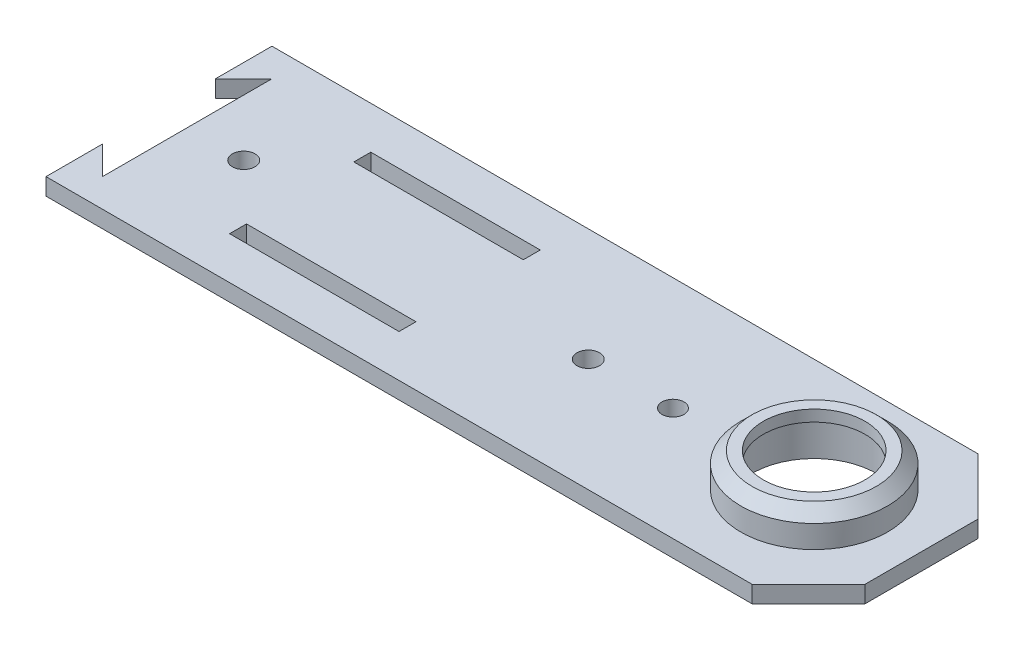
ISO-10303-21;
HEADER;
FILE_DESCRIPTION(('STEP AP214'),'2;1');
FILE_NAME('part.step','',(''),(''),'','','');
FILE_SCHEMA(('AUTOMOTIVE_DESIGN { 1 0 10303 214 1 1 1 1 }'));
ENDSEC;
DATA;
#1=APPLICATION_CONTEXT('core data for automotive mechanical design processes');
#2=APPLICATION_PROTOCOL_DEFINITION('international standard','automotive_design',2000,#1);
#3=PRODUCT_CONTEXT('',#1,'mechanical');
#4=PRODUCT('Part','Part','',(#3));
#5=PRODUCT_RELATED_PRODUCT_CATEGORY('part','',(#4));
#6=PRODUCT_DEFINITION_FORMATION('','',#4);
#7=PRODUCT_DEFINITION_CONTEXT('part definition',#1,'design');
#8=PRODUCT_DEFINITION('design','',#6,#7);
#9=PRODUCT_DEFINITION_SHAPE('','',#8);
#10=(LENGTH_UNIT() NAMED_UNIT(*) SI_UNIT(.MILLI.,.METRE.));
#11=(NAMED_UNIT(*) PLANE_ANGLE_UNIT() SI_UNIT($,.RADIAN.));
#12=(NAMED_UNIT(*) SI_UNIT($,.STERADIAN.) SOLID_ANGLE_UNIT());
#13=UNCERTAINTY_MEASURE_WITH_UNIT(LENGTH_MEASURE(1.E-05),#10,'distance_accuracy_value','');
#14=(GEOMETRIC_REPRESENTATION_CONTEXT(3) GLOBAL_UNCERTAINTY_ASSIGNED_CONTEXT((#13)) GLOBAL_UNIT_ASSIGNED_CONTEXT((#10,
#11,#12)) REPRESENTATION_CONTEXT('',''));
#15=CARTESIAN_POINT('',(0.,0.,0.));
#16=DIRECTION('',(0.,0.,1.));
#17=DIRECTION('',(1.,0.,0.));
#18=AXIS2_PLACEMENT_3D('',#15,#16,#17);
#19=CARTESIAN_POINT('',(0.,3.,0.));
#20=DIRECTION('',(0.,-1.,0.));
#21=DIRECTION('',(0.,0.,-1.));
#22=AXIS2_PLACEMENT_3D('',#19,#20,#21);
#23=PLANE('',#22);
#24=DIRECTION('',(0.,0.,-1.));
#25=VECTOR('',#24,1.);
#26=CARTESIAN_POINT('',(-12.5,3.,12.5));
#27=LINE('',#26,#25);
#28=CARTESIAN_POINT('',(-12.5,3.,12.5));
#29=VERTEX_POINT('',#28);
#30=CARTESIAN_POINT('',(-12.5,3.,9.5));
#31=VERTEX_POINT('',#30);
#32=EDGE_CURVE('E176',#29,#31,#27,.T.);
#33=ORIENTED_EDGE('',*,*,#32,.F.);
#34=DIRECTION('',(1.,0.,0.));
#35=VECTOR('',#34,1.);
#36=CARTESIAN_POINT('',(-42.5,3.,12.5));
#37=LINE('',#36,#35);
#38=CARTESIAN_POINT('',(-42.5,3.,12.5));
#39=VERTEX_POINT('',#38);
#40=EDGE_CURVE('E206',#39,#29,#37,.T.);
#41=ORIENTED_EDGE('',*,*,#40,.F.);
#42=DIRECTION('',(0.,0.,1.));
#43=VECTOR('',#42,1.);
#44=CARTESIAN_POINT('',(-42.5,3.,12.5));
#45=LINE('',#44,#43);
#46=CARTESIAN_POINT('',(-42.5,3.,9.5));
#47=VERTEX_POINT('',#46);
#48=EDGE_CURVE('E202',#47,#39,#45,.T.);
#49=ORIENTED_EDGE('',*,*,#48,.F.);
#50=DIRECTION('',(-1.,0.,0.));
#51=VECTOR('',#50,1.);
#52=CARTESIAN_POINT('',(-42.5,3.,9.5));
#53=LINE('',#52,#51);
#54=EDGE_CURVE('E187',#31,#47,#53,.T.);
#55=ORIENTED_EDGE('',*,*,#54,.F.);
#56=EDGE_LOOP('',(#33,#41,#49,#55));
#57=FACE_BOUND('',#56,.T.);
#58=CARTESIAN_POINT('',(8.50000000000001,3.,0.));
#59=DIRECTION('',(0.,1.,0.));
#60=DIRECTION('',(0.,0.,1.));
#61=AXIS2_PLACEMENT_3D('',#58,#59,#60);
#62=CIRCLE('',#61,2.);
#63=CARTESIAN_POINT('',(8.50000000000001,3.,2.));
#64=VERTEX_POINT('',#63);
#65=EDGE_CURVE('E287',#64,#64,#62,.T.);
#66=ORIENTED_EDGE('',*,*,#65,.F.);
#67=EDGE_LOOP('',(#66));
#68=FACE_BOUND('',#67,.T.);
#69=CARTESIAN_POINT('',(23.5,3.,0.));
#70=DIRECTION('',(0.,1.,0.));
#71=DIRECTION('',(0.,0.,1.));
#72=AXIS2_PLACEMENT_3D('',#69,#70,#71);
#73=CIRCLE('',#72,1.93767259060063);
#74=CARTESIAN_POINT('',(23.5,3.,1.93767259060063));
#75=VERTEX_POINT('',#74);
#76=EDGE_CURVE('E295',#75,#75,#73,.T.);
#77=ORIENTED_EDGE('',*,*,#76,.F.);
#78=EDGE_LOOP('',(#77));
#79=FACE_BOUND('',#78,.T.);
#80=DIRECTION('',(1.,0.,0.));
#81=VECTOR('',#80,1.);
#82=CARTESIAN_POINT('',(-67.5,3.,20.));
#83=LINE('',#82,#81);
#84=CARTESIAN_POINT('',(-67.5,3.,20.));
#85=VERTEX_POINT('',#84);
#86=CARTESIAN_POINT('',(57.5,3.,20.));
#87=VERTEX_POINT('',#86);
#88=EDGE_CURVE('E325',#85,#87,#83,.T.);
#89=ORIENTED_EDGE('',*,*,#88,.T.);
#90=DIRECTION('',(-0.707106781186548,0.,0.707106781186547));
#91=VECTOR('',#90,1.);
#92=CARTESIAN_POINT('',(67.5,3.,9.99999999999999));
#93=LINE('',#92,#91);
#94=CARTESIAN_POINT('',(67.5,3.,9.99999999999999));
#95=VERTEX_POINT('',#94);
#96=EDGE_CURVE('E55',#87,#95,#93,.F.);
#97=ORIENTED_EDGE('',*,*,#96,.T.);
#98=DIRECTION('',(0.,0.,-1.));
#99=VECTOR('',#98,1.);
#100=CARTESIAN_POINT('',(67.5,3.,20.));
#101=LINE('',#100,#99);
#102=CARTESIAN_POINT('',(67.5,3.,-9.99999999999995));
#103=VERTEX_POINT('',#102);
#104=EDGE_CURVE('E303',#95,#103,#101,.T.);
#105=ORIENTED_EDGE('',*,*,#104,.T.);
#106=DIRECTION('',(0.707106781186546,0.,0.707106781186549));
#107=VECTOR('',#106,1.);
#108=CARTESIAN_POINT('',(57.5,3.,-20.));
#109=LINE('',#108,#107);
#110=CARTESIAN_POINT('',(57.5,3.,-20.));
#111=VERTEX_POINT('',#110);
#112=EDGE_CURVE('E62',#103,#111,#109,.F.);
#113=ORIENTED_EDGE('',*,*,#112,.T.);
#114=DIRECTION('',(-1.,0.,0.));
#115=VECTOR('',#114,1.);
#116=CARTESIAN_POINT('',(-67.5,3.,-20.));
#117=LINE('',#116,#115);
#118=CARTESIAN_POINT('',(-67.5,3.,-20.));
#119=VERTEX_POINT('',#118);
#120=EDGE_CURVE('E306',#111,#119,#117,.T.);
#121=ORIENTED_EDGE('',*,*,#120,.T.);
#122=DIRECTION('',(0.,0.,1.));
#123=VECTOR('',#122,1.);
#124=CARTESIAN_POINT('',(-67.5,3.,-10.0000000000001));
#125=LINE('',#124,#123);
#126=CARTESIAN_POINT('',(-67.5,3.,-10.0000000000001));
#127=VERTEX_POINT('',#126);
#128=EDGE_CURVE('E310',#119,#127,#125,.T.);
#129=ORIENTED_EDGE('',*,*,#128,.T.);
#130=DIRECTION('',(0.707106781186548,0.,-0.707106781186547));
#131=VECTOR('',#130,1.);
#132=CARTESIAN_POINT('',(-67.5,3.,-10.0000000000001));
#133=LINE('',#132,#131);
#134=CARTESIAN_POINT('',(-62.5,3.,-15.));
#135=VERTEX_POINT('',#134);
#136=EDGE_CURVE('E313',#127,#135,#133,.T.);
#137=ORIENTED_EDGE('',*,*,#136,.T.);
#138=DIRECTION('',(0.,0.,1.));
#139=VECTOR('',#138,1.);
#140=CARTESIAN_POINT('',(-62.5,3.,-15.));
#141=LINE('',#140,#139);
#142=CARTESIAN_POINT('',(-62.5,3.,15.));
#143=VERTEX_POINT('',#142);
#144=EDGE_CURVE('E316',#135,#143,#141,.T.);
#145=ORIENTED_EDGE('',*,*,#144,.T.);
#146=DIRECTION('',(-0.707106781186538,0.,-0.707106781186556));
#147=VECTOR('',#146,1.);
#148=CARTESIAN_POINT('',(-62.5,3.,15.));
#149=LINE('',#148,#147);
#150=CARTESIAN_POINT('',(-67.5,3.,9.99999999999992));
#151=VERTEX_POINT('',#150);
#152=EDGE_CURVE('E319',#143,#151,#149,.T.);
#153=ORIENTED_EDGE('',*,*,#152,.T.);
#154=DIRECTION('',(0.,0.,1.));
#155=VECTOR('',#154,1.);
#156=CARTESIAN_POINT('',(-67.5,3.,20.));
#157=LINE('',#156,#155);
#158=EDGE_CURVE('E322',#151,#85,#157,.T.);
#159=ORIENTED_EDGE('',*,*,#158,.T.);
#160=EDGE_LOOP('',(#89,#97,#105,#113,#121,#129,#137,#145,#153,#159));
#161=FACE_BOUND('',#160,.T.);
#162=DIRECTION('',(0.,0.,-1.));
#163=VECTOR('',#162,1.);
#164=CARTESIAN_POINT('',(-12.5,3.,-9.5));
#165=LINE('',#164,#163);
#166=CARTESIAN_POINT('',(-12.5,3.,-9.5));
#167=VERTEX_POINT('',#166);
#168=CARTESIAN_POINT('',(-12.5,3.,-12.5));
#169=VERTEX_POINT('',#168);
#170=EDGE_CURVE('E240',#167,#169,#165,.T.);
#171=ORIENTED_EDGE('',*,*,#170,.F.);
#172=DIRECTION('',(1.,0.,0.));
#173=VECTOR('',#172,1.);
#174=CARTESIAN_POINT('',(-42.5,3.,-9.5));
#175=LINE('',#174,#173);
#176=CARTESIAN_POINT('',(-42.5,3.,-9.5));
#177=VERTEX_POINT('',#176);
#178=EDGE_CURVE('E251',#177,#167,#175,.T.);
#179=ORIENTED_EDGE('',*,*,#178,.F.);
#180=DIRECTION('',(0.,0.,1.));
#181=VECTOR('',#180,1.);
#182=CARTESIAN_POINT('',(-42.5,3.,-9.5));
#183=LINE('',#182,#181);
#184=CARTESIAN_POINT('',(-42.5,3.,-12.5));
#185=VERTEX_POINT('',#184);
#186=EDGE_CURVE('E247',#185,#177,#183,.T.);
#187=ORIENTED_EDGE('',*,*,#186,.F.);
#188=DIRECTION('',(-1.,0.,0.));
#189=VECTOR('',#188,1.);
#190=CARTESIAN_POINT('',(-42.5,3.,-12.5));
#191=LINE('',#190,#189);
#192=EDGE_CURVE('E243',#169,#185,#191,.T.);
#193=ORIENTED_EDGE('',*,*,#192,.F.);
#194=EDGE_LOOP('',(#171,#179,#187,#193));
#195=FACE_BOUND('',#194,.T.);
#196=CARTESIAN_POINT('',(-52.5,3.,0.));
#197=DIRECTION('',(0.,1.,0.));
#198=DIRECTION('',(0.,0.,1.));
#199=AXIS2_PLACEMENT_3D('',#196,#197,#198);
#200=CIRCLE('',#199,2.);
#201=CARTESIAN_POINT('',(-52.5,3.,2.));
#202=VERTEX_POINT('',#201);
#203=EDGE_CURVE('E232',#202,#202,#200,.T.);
#204=ORIENTED_EDGE('',*,*,#203,.F.);
#205=EDGE_LOOP('',(#204));
#206=FACE_BOUND('',#205,.T.);
#207=CARTESIAN_POINT('',(48.5,3.,0.));
#208=DIRECTION('',(0.,-1.,0.));
#209=DIRECTION('',(0.,0.,-1.));
#210=AXIS2_PLACEMENT_3D('',#207,#208,#209);
#211=CIRCLE('',#210,13.);
#212=CARTESIAN_POINT('',(48.5,3.,-13.));
#213=VERTEX_POINT('',#212);
#214=EDGE_CURVE('E375',#213,#213,#211,.F.);
#215=ORIENTED_EDGE('',*,*,#214,.F.);
#216=EDGE_LOOP('',(#215));
#217=FACE_BOUND('',#216,.T.);
#218=ADVANCED_FACE('F45',(#57,#68,#79,#161,#195,#206,#217),#23,.F.);
#219=CARTESIAN_POINT('',(0.,0.,0.));
#220=DIRECTION('',(0.,-1.,0.));
#221=DIRECTION('',(0.,0.,-1.));
#222=AXIS2_PLACEMENT_3D('',#219,#220,#221);
#223=PLANE('',#222);
#224=DIRECTION('',(1.,0.,0.));
#225=VECTOR('',#224,1.);
#226=CARTESIAN_POINT('',(-42.5,0.,-9.5));
#227=LINE('',#226,#225);
#228=CARTESIAN_POINT('',(-42.5,0.,-9.5));
#229=VERTEX_POINT('',#228);
#230=CARTESIAN_POINT('',(-12.5,0.,-9.5));
#231=VERTEX_POINT('',#230);
#232=EDGE_CURVE('E244',#229,#231,#227,.T.);
#233=ORIENTED_EDGE('',*,*,#232,.T.);
#234=DIRECTION('',(0.,0.,-1.));
#235=VECTOR('',#234,1.);
#236=CARTESIAN_POINT('',(-12.5,0.,-9.5));
#237=LINE('',#236,#235);
#238=CARTESIAN_POINT('',(-12.5,0.,-12.5));
#239=VERTEX_POINT('',#238);
#240=EDGE_CURVE('E236',#231,#239,#237,.T.);
#241=ORIENTED_EDGE('',*,*,#240,.T.);
#242=DIRECTION('',(-1.,0.,0.));
#243=VECTOR('',#242,1.);
#244=CARTESIAN_POINT('',(-42.5,0.,-12.5));
#245=LINE('',#244,#243);
#246=CARTESIAN_POINT('',(-42.5,0.,-12.5));
#247=VERTEX_POINT('',#246);
#248=EDGE_CURVE('E258',#239,#247,#245,.T.);
#249=ORIENTED_EDGE('',*,*,#248,.T.);
#250=DIRECTION('',(0.,0.,1.));
#251=VECTOR('',#250,1.);
#252=CARTESIAN_POINT('',(-42.5,0.,-9.5));
#253=LINE('',#252,#251);
#254=EDGE_CURVE('E262',#247,#229,#253,.T.);
#255=ORIENTED_EDGE('',*,*,#254,.T.);
#256=EDGE_LOOP('',(#233,#241,#249,#255));
#257=FACE_BOUND('',#256,.T.);
#258=CARTESIAN_POINT('',(48.5,0.,0.));
#259=DIRECTION('',(0.,1.,0.));
#260=DIRECTION('',(0.,0.,1.));
#261=AXIS2_PLACEMENT_3D('',#258,#259,#260);
#262=CIRCLE('',#261,11.);
#263=CARTESIAN_POINT('',(48.5,0.,11.));
#264=VERTEX_POINT('',#263);
#265=EDGE_CURVE('E282',#264,#264,#262,.T.);
#266=ORIENTED_EDGE('',*,*,#265,.T.);
#267=EDGE_LOOP('',(#266));
#268=FACE_BOUND('',#267,.T.);
#269=CARTESIAN_POINT('',(23.5,0.,0.));
#270=DIRECTION('',(0.,1.,0.));
#271=DIRECTION('',(0.,0.,1.));
#272=AXIS2_PLACEMENT_3D('',#269,#270,#271);
#273=CIRCLE('',#272,1.93767259060063);
#274=CARTESIAN_POINT('',(23.5,0.,1.93767259060063));
#275=VERTEX_POINT('',#274);
#276=EDGE_CURVE('E291',#275,#275,#273,.T.);
#277=ORIENTED_EDGE('',*,*,#276,.T.);
#278=EDGE_LOOP('',(#277));
#279=FACE_BOUND('',#278,.T.);
#280=DIRECTION('',(0.,0.,-1.));
#281=VECTOR('',#280,1.);
#282=CARTESIAN_POINT('',(67.5,0.,20.));
#283=LINE('',#282,#281);
#284=CARTESIAN_POINT('',(67.5,0.,9.99999999999999));
#285=VERTEX_POINT('',#284);
#286=CARTESIAN_POINT('',(67.5,0.,-9.99999999999995));
#287=VERTEX_POINT('',#286);
#288=EDGE_CURVE('E299',#285,#287,#283,.T.);
#289=ORIENTED_EDGE('',*,*,#288,.F.);
#290=DIRECTION('',(0.707106781186548,0.,-0.707106781186547));
#291=VECTOR('',#290,1.);
#292=CARTESIAN_POINT('',(38.75,0.,38.75));
#293=LINE('',#292,#291);
#294=CARTESIAN_POINT('',(57.5,0.,20.));
#295=VERTEX_POINT('',#294);
#296=EDGE_CURVE('E397',#285,#295,#293,.F.);
#297=ORIENTED_EDGE('',*,*,#296,.T.);
#298=DIRECTION('',(1.,0.,0.));
#299=VECTOR('',#298,1.);
#300=CARTESIAN_POINT('',(-67.5,0.,20.));
#301=LINE('',#300,#299);
#302=CARTESIAN_POINT('',(-67.5,0.,20.));
#303=VERTEX_POINT('',#302);
#304=EDGE_CURVE('E307',#303,#295,#301,.T.);
#305=ORIENTED_EDGE('',*,*,#304,.F.);
#306=DIRECTION('',(0.,0.,1.));
#307=VECTOR('',#306,1.);
#308=CARTESIAN_POINT('',(-67.5,0.,20.));
#309=LINE('',#308,#307);
#310=CARTESIAN_POINT('',(-67.5,0.,9.99999999999992));
#311=VERTEX_POINT('',#310);
#312=EDGE_CURVE('E347',#311,#303,#309,.T.);
#313=ORIENTED_EDGE('',*,*,#312,.F.);
#314=DIRECTION('',(-0.707106781186538,0.,-0.707106781186556));
#315=VECTOR('',#314,1.);
#316=CARTESIAN_POINT('',(-62.5,0.,15.));
#317=LINE('',#316,#315);
#318=CARTESIAN_POINT('',(-62.5,0.,15.));
#319=VERTEX_POINT('',#318);
#320=EDGE_CURVE('E344',#319,#311,#317,.T.);
#321=ORIENTED_EDGE('',*,*,#320,.F.);
#322=DIRECTION('',(0.,0.,1.));
#323=VECTOR('',#322,1.);
#324=CARTESIAN_POINT('',(-62.5,0.,-15.));
#325=LINE('',#324,#323);
#326=CARTESIAN_POINT('',(-62.5,0.,-15.));
#327=VERTEX_POINT('',#326);
#328=EDGE_CURVE('E341',#327,#319,#325,.T.);
#329=ORIENTED_EDGE('',*,*,#328,.F.);
#330=DIRECTION('',(0.707106781186548,0.,-0.707106781186547));
#331=VECTOR('',#330,1.);
#332=CARTESIAN_POINT('',(-67.5,0.,-10.0000000000001));
#333=LINE('',#332,#331);
#334=CARTESIAN_POINT('',(-67.5,0.,-10.0000000000001));
#335=VERTEX_POINT('',#334);
#336=EDGE_CURVE('E338',#335,#327,#333,.T.);
#337=ORIENTED_EDGE('',*,*,#336,.F.);
#338=DIRECTION('',(0.,0.,1.));
#339=VECTOR('',#338,1.);
#340=CARTESIAN_POINT('',(-67.5,0.,-10.0000000000001));
#341=LINE('',#340,#339);
#342=CARTESIAN_POINT('',(-67.5,0.,-20.));
#343=VERTEX_POINT('',#342);
#344=EDGE_CURVE('E335',#343,#335,#341,.T.);
#345=ORIENTED_EDGE('',*,*,#344,.F.);
#346=DIRECTION('',(-1.,0.,0.));
#347=VECTOR('',#346,1.);
#348=CARTESIAN_POINT('',(-67.5,0.,-20.));
#349=LINE('',#348,#347);
#350=CARTESIAN_POINT('',(57.5,0.,-20.));
#351=VERTEX_POINT('',#350);
#352=EDGE_CURVE('E332',#351,#343,#349,.T.);
#353=ORIENTED_EDGE('',*,*,#352,.F.);
#354=DIRECTION('',(-0.707106781186546,0.,-0.707106781186549));
#355=VECTOR('',#354,1.);
#356=CARTESIAN_POINT('',(38.7500000000001,0.,-38.75));
#357=LINE('',#356,#355);
#358=EDGE_CURVE('E394',#351,#287,#357,.F.);
#359=ORIENTED_EDGE('',*,*,#358,.T.);
#360=EDGE_LOOP('',(#289,#297,#305,#313,#321,#329,#337,#345,#353,#359));
#361=FACE_BOUND('',#360,.T.);
#362=CARTESIAN_POINT('',(8.50000000000001,0.,0.));
#363=DIRECTION('',(0.,1.,0.));
#364=DIRECTION('',(0.,0.,1.));
#365=AXIS2_PLACEMENT_3D('',#362,#363,#364);
#366=CIRCLE('',#365,2.);
#367=CARTESIAN_POINT('',(8.50000000000001,0.,2.));
#368=VERTEX_POINT('',#367);
#369=EDGE_CURVE('E286',#368,#368,#366,.T.);
#370=ORIENTED_EDGE('',*,*,#369,.T.);
#371=EDGE_LOOP('',(#370));
#372=FACE_BOUND('',#371,.T.);
#373=CARTESIAN_POINT('',(-52.5,0.,0.));
#374=DIRECTION('',(0.,1.,0.));
#375=DIRECTION('',(0.,0.,1.));
#376=AXIS2_PLACEMENT_3D('',#373,#374,#375);
#377=CIRCLE('',#376,2.);
#378=CARTESIAN_POINT('',(-52.5,0.,2.));
#379=VERTEX_POINT('',#378);
#380=EDGE_CURVE('E196',#379,#379,#377,.T.);
#381=ORIENTED_EDGE('',*,*,#380,.T.);
#382=EDGE_LOOP('',(#381));
#383=FACE_BOUND('',#382,.T.);
#384=DIRECTION('',(1.,0.,0.));
#385=VECTOR('',#384,1.);
#386=CARTESIAN_POINT('',(-42.5,0.,12.5));
#387=LINE('',#386,#385);
#388=CARTESIAN_POINT('',(-42.5,0.,12.5));
#389=VERTEX_POINT('',#388);
#390=CARTESIAN_POINT('',(-12.5,0.,12.5));
#391=VERTEX_POINT('',#390);
#392=EDGE_CURVE('E188',#389,#391,#387,.T.);
#393=ORIENTED_EDGE('',*,*,#392,.T.);
#394=DIRECTION('',(0.,0.,-1.));
#395=VECTOR('',#394,1.);
#396=CARTESIAN_POINT('',(-12.5,0.,12.5));
#397=LINE('',#396,#395);
#398=CARTESIAN_POINT('',(-12.5,0.,9.5));
#399=VERTEX_POINT('',#398);
#400=EDGE_CURVE('E212',#391,#399,#397,.T.);
#401=ORIENTED_EDGE('',*,*,#400,.T.);
#402=DIRECTION('',(-1.,0.,0.));
#403=VECTOR('',#402,1.);
#404=CARTESIAN_POINT('',(-42.5,0.,9.5));
#405=LINE('',#404,#403);
#406=CARTESIAN_POINT('',(-42.5,0.,9.5));
#407=VERTEX_POINT('',#406);
#408=EDGE_CURVE('E194',#399,#407,#405,.T.);
#409=ORIENTED_EDGE('',*,*,#408,.T.);
#410=DIRECTION('',(0.,0.,1.));
#411=VECTOR('',#410,1.);
#412=CARTESIAN_POINT('',(-42.5,0.,12.5));
#413=LINE('',#412,#411);
#414=EDGE_CURVE('E218',#407,#389,#413,.T.);
#415=ORIENTED_EDGE('',*,*,#414,.T.);
#416=EDGE_LOOP('',(#393,#401,#409,#415));
#417=FACE_BOUND('',#416,.T.);
#418=ADVANCED_FACE('F416',(#257,#268,#279,#361,#372,#383,#417),#223,.T.);
#419=CARTESIAN_POINT('',(67.5,3.,20.));
#420=DIRECTION('',(-1.,0.,0.));
#421=DIRECTION('',(0.,0.,1.));
#422=AXIS2_PLACEMENT_3D('',#419,#420,#421);
#423=PLANE('',#422);
#424=ORIENTED_EDGE('',*,*,#104,.F.);
#425=DIRECTION('',(0.,-1.,0.));
#426=VECTOR('',#425,1.);
#427=CARTESIAN_POINT('',(67.5,3.,9.99999999999999));
#428=LINE('',#427,#426);
#429=EDGE_CURVE('E390',#95,#285,#428,.T.);
#430=ORIENTED_EDGE('',*,*,#429,.T.);
#431=ORIENTED_EDGE('',*,*,#288,.T.);
#432=DIRECTION('',(0.,1.,0.));
#433=VECTOR('',#432,1.);
#434=CARTESIAN_POINT('',(67.5,3.,-9.99999999999995));
#435=LINE('',#434,#433);
#436=EDGE_CURVE('E387',#287,#103,#435,.T.);
#437=ORIENTED_EDGE('',*,*,#436,.T.);
#438=EDGE_LOOP('',(#424,#430,#431,#437));
#439=FACE_BOUND('',#438,.T.);
#440=ADVANCED_FACE('F410',(#439),#423,.F.);
#441=CARTESIAN_POINT('',(-67.5,3.,-20.));
#442=DIRECTION('',(0.,0.,1.));
#443=DIRECTION('',(1.,0.,0.));
#444=AXIS2_PLACEMENT_3D('',#441,#442,#443);
#445=PLANE('',#444);
#446=ORIENTED_EDGE('',*,*,#120,.F.);
#447=DIRECTION('',(0.,-1.,0.));
#448=VECTOR('',#447,1.);
#449=CARTESIAN_POINT('',(57.5,3.,-20.));
#450=LINE('',#449,#448);
#451=EDGE_CURVE('E11',#111,#351,#450,.T.);
#452=ORIENTED_EDGE('',*,*,#451,.T.);
#453=ORIENTED_EDGE('',*,*,#352,.T.);
#454=DIRECTION('',(0.,-1.,0.));
#455=VECTOR('',#454,1.);
#456=CARTESIAN_POINT('',(-67.5,3.,-20.));
#457=LINE('',#456,#455);
#458=EDGE_CURVE('E371',#119,#343,#457,.T.);
#459=ORIENTED_EDGE('',*,*,#458,.F.);
#460=EDGE_LOOP('',(#446,#452,#453,#459));
#461=FACE_BOUND('',#460,.T.);
#462=ADVANCED_FACE('F447',(#461),#445,.F.);
#463=CARTESIAN_POINT('',(-67.5,3.,-10.0000000000001));
#464=DIRECTION('',(1.,0.,0.));
#465=DIRECTION('',(0.,0.,-1.));
#466=AXIS2_PLACEMENT_3D('',#463,#464,#465);
#467=PLANE('',#466);
#468=ORIENTED_EDGE('',*,*,#344,.T.);
#469=DIRECTION('',(0.,-1.,0.));
#470=VECTOR('',#469,1.);
#471=CARTESIAN_POINT('',(-67.5,3.,-10.0000000000001));
#472=LINE('',#471,#470);
#473=EDGE_CURVE('E367',#127,#335,#472,.T.);
#474=ORIENTED_EDGE('',*,*,#473,.F.);
#475=ORIENTED_EDGE('',*,*,#128,.F.);
#476=ORIENTED_EDGE('',*,*,#458,.T.);
#477=EDGE_LOOP('',(#468,#474,#475,#476));
#478=FACE_BOUND('',#477,.T.);
#479=ADVANCED_FACE('F443',(#478),#467,.F.);
#480=CARTESIAN_POINT('',(-67.5,3.,-10.0000000000001));
#481=DIRECTION('',(-0.707106781186547,0.,-0.707106781186548));
#482=DIRECTION('',(-0.707106781186548,0.,0.707106781186547));
#483=AXIS2_PLACEMENT_3D('',#480,#481,#482);
#484=PLANE('',#483);
#485=ORIENTED_EDGE('',*,*,#336,.T.);
#486=DIRECTION('',(0.,-1.,0.));
#487=VECTOR('',#486,1.);
#488=CARTESIAN_POINT('',(-62.5,3.,-15.));
#489=LINE('',#488,#487);
#490=EDGE_CURVE('E363',#135,#327,#489,.T.);
#491=ORIENTED_EDGE('',*,*,#490,.F.);
#492=ORIENTED_EDGE('',*,*,#136,.F.);
#493=ORIENTED_EDGE('',*,*,#473,.T.);
#494=EDGE_LOOP('',(#485,#491,#492,#493));
#495=FACE_BOUND('',#494,.T.);
#496=ADVANCED_FACE('F438',(#495),#484,.F.);
#497=CARTESIAN_POINT('',(-62.5,3.,-15.));
#498=DIRECTION('',(1.,0.,0.));
#499=DIRECTION('',(0.,0.,-1.));
#500=AXIS2_PLACEMENT_3D('',#497,#498,#499);
#501=PLANE('',#500);
#502=ORIENTED_EDGE('',*,*,#328,.T.);
#503=DIRECTION('',(0.,-1.,0.));
#504=VECTOR('',#503,1.);
#505=CARTESIAN_POINT('',(-62.5,3.,15.));
#506=LINE('',#505,#504);
#507=EDGE_CURVE('E359',#143,#319,#506,.T.);
#508=ORIENTED_EDGE('',*,*,#507,.F.);
#509=ORIENTED_EDGE('',*,*,#144,.F.);
#510=ORIENTED_EDGE('',*,*,#490,.T.);
#511=EDGE_LOOP('',(#502,#508,#509,#510));
#512=FACE_BOUND('',#511,.T.);
#513=ADVANCED_FACE('F434',(#512),#501,.F.);
#514=CARTESIAN_POINT('',(-62.5,3.,15.));
#515=DIRECTION('',(-0.707106781186557,0.,0.707106781186538));
#516=DIRECTION('',(0.707106781186538,0.,0.707106781186557));
#517=AXIS2_PLACEMENT_3D('',#514,#515,#516);
#518=PLANE('',#517);
#519=ORIENTED_EDGE('',*,*,#320,.T.);
#520=DIRECTION('',(0.,-1.,0.));
#521=VECTOR('',#520,1.);
#522=CARTESIAN_POINT('',(-67.5,3.,9.99999999999992));
#523=LINE('',#522,#521);
#524=EDGE_CURVE('E355',#151,#311,#523,.T.);
#525=ORIENTED_EDGE('',*,*,#524,.F.);
#526=ORIENTED_EDGE('',*,*,#152,.F.);
#527=ORIENTED_EDGE('',*,*,#507,.T.);
#528=EDGE_LOOP('',(#519,#525,#526,#527));
#529=FACE_BOUND('',#528,.T.);
#530=ADVANCED_FACE('F429',(#529),#518,.F.);
#531=CARTESIAN_POINT('',(-67.5,3.,20.));
#532=DIRECTION('',(1.,0.,0.));
#533=DIRECTION('',(0.,0.,-1.));
#534=AXIS2_PLACEMENT_3D('',#531,#532,#533);
#535=PLANE('',#534);
#536=ORIENTED_EDGE('',*,*,#312,.T.);
#537=DIRECTION('',(0.,-1.,0.));
#538=VECTOR('',#537,1.);
#539=CARTESIAN_POINT('',(-67.5,3.,20.));
#540=LINE('',#539,#538);
#541=EDGE_CURVE('E328',#85,#303,#540,.T.);
#542=ORIENTED_EDGE('',*,*,#541,.F.);
#543=ORIENTED_EDGE('',*,*,#158,.F.);
#544=ORIENTED_EDGE('',*,*,#524,.T.);
#545=EDGE_LOOP('',(#536,#542,#543,#544));
#546=FACE_BOUND('',#545,.T.);
#547=ADVANCED_FACE('F423',(#546),#535,.F.);
#548=CARTESIAN_POINT('',(-67.5,3.,20.));
#549=DIRECTION('',(0.,0.,-1.));
#550=DIRECTION('',(-1.,0.,0.));
#551=AXIS2_PLACEMENT_3D('',#548,#549,#550);
#552=PLANE('',#551);
#553=ORIENTED_EDGE('',*,*,#304,.T.);
#554=DIRECTION('',(0.,1.,0.));
#555=VECTOR('',#554,1.);
#556=CARTESIAN_POINT('',(57.5,3.,20.));
#557=LINE('',#556,#555);
#558=EDGE_CURVE('E70',#295,#87,#557,.T.);
#559=ORIENTED_EDGE('',*,*,#558,.T.);
#560=ORIENTED_EDGE('',*,*,#88,.F.);
#561=ORIENTED_EDGE('',*,*,#541,.T.);
#562=EDGE_LOOP('',(#553,#559,#560,#561));
#563=FACE_BOUND('',#562,.T.);
#564=ADVANCED_FACE('F419',(#563),#552,.F.);
#565=CARTESIAN_POINT('',(23.5,3.,0.));
#566=DIRECTION('',(0.,-1.,0.));
#567=DIRECTION('',(0.,0.,-1.));
#568=AXIS2_PLACEMENT_3D('',#565,#566,#567);
#569=CYLINDRICAL_SURFACE('',#568,1.93767259060063);
#570=ORIENTED_EDGE('',*,*,#76,.T.);
#571=EDGE_LOOP('',(#570));
#572=FACE_BOUND('',#571,.T.);
#573=ORIENTED_EDGE('',*,*,#276,.F.);
#574=EDGE_LOOP('',(#573));
#575=FACE_BOUND('',#574,.T.);
#576=ADVANCED_FACE('F463',(#572,#575),#569,.F.);
#577=CARTESIAN_POINT('',(8.50000000000001,3.,0.));
#578=DIRECTION('',(0.,-1.,0.));
#579=DIRECTION('',(0.,0.,-1.));
#580=AXIS2_PLACEMENT_3D('',#577,#578,#579);
#581=CYLINDRICAL_SURFACE('',#580,2.);
#582=ORIENTED_EDGE('',*,*,#65,.T.);
#583=EDGE_LOOP('',(#582));
#584=FACE_BOUND('',#583,.T.);
#585=ORIENTED_EDGE('',*,*,#369,.F.);
#586=EDGE_LOOP('',(#585));
#587=FACE_BOUND('',#586,.T.);
#588=ADVANCED_FACE('F530',(#584,#587),#581,.F.);
#589=CARTESIAN_POINT('',(48.5,3.,0.));
#590=DIRECTION('',(0.,-1.,0.));
#591=DIRECTION('',(0.,0.,-1.));
#592=AXIS2_PLACEMENT_3D('',#589,#590,#591);
#593=CYLINDRICAL_SURFACE('',#592,11.);
#594=ORIENTED_EDGE('',*,*,#265,.F.);
#595=EDGE_LOOP('',(#594));
#596=FACE_BOUND('',#595,.T.);
#597=CARTESIAN_POINT('',(48.5,7.,0.));
#598=DIRECTION('',(0.,1.,0.));
#599=DIRECTION('',(0.,0.,1.));
#600=AXIS2_PLACEMENT_3D('',#597,#598,#599);
#601=CIRCLE('',#600,11.);
#602=CARTESIAN_POINT('',(48.5,7.,11.));
#603=VERTEX_POINT('',#602);
#604=EDGE_CURVE('E215',#603,#603,#601,.T.);
#605=ORIENTED_EDGE('',*,*,#604,.T.);
#606=EDGE_LOOP('',(#605));
#607=FACE_BOUND('',#606,.T.);
#608=ADVANCED_FACE('F527',(#596,#607),#593,.F.);
#609=CARTESIAN_POINT('',(-12.5,3.,-9.5));
#610=DIRECTION('',(-1.,0.,0.));
#611=DIRECTION('',(0.,0.,1.));
#612=AXIS2_PLACEMENT_3D('',#609,#610,#611);
#613=PLANE('',#612);
#614=ORIENTED_EDGE('',*,*,#240,.F.);
#615=DIRECTION('',(0.,-1.,0.));
#616=VECTOR('',#615,1.);
#617=CARTESIAN_POINT('',(-12.5,3.,-9.5));
#618=LINE('',#617,#616);
#619=EDGE_CURVE('E254',#167,#231,#618,.T.);
#620=ORIENTED_EDGE('',*,*,#619,.F.);
#621=ORIENTED_EDGE('',*,*,#170,.T.);
#622=DIRECTION('',(0.,-1.,0.));
#623=VECTOR('',#622,1.);
#624=CARTESIAN_POINT('',(-12.5,3.,-12.5));
#625=LINE('',#624,#623);
#626=EDGE_CURVE('E278',#169,#239,#625,.T.);
#627=ORIENTED_EDGE('',*,*,#626,.T.);
#628=EDGE_LOOP('',(#614,#620,#621,#627));
#629=FACE_BOUND('',#628,.T.);
#630=ADVANCED_FACE('F529',(#629),#613,.T.);
#631=CARTESIAN_POINT('',(-42.5,3.,-12.5));
#632=DIRECTION('',(0.,0.,1.));
#633=DIRECTION('',(1.,0.,0.));
#634=AXIS2_PLACEMENT_3D('',#631,#632,#633);
#635=PLANE('',#634);
#636=ORIENTED_EDGE('',*,*,#248,.F.);
#637=ORIENTED_EDGE('',*,*,#626,.F.);
#638=ORIENTED_EDGE('',*,*,#192,.T.);
#639=DIRECTION('',(0.,-1.,0.));
#640=VECTOR('',#639,1.);
#641=CARTESIAN_POINT('',(-42.5,3.,-12.5));
#642=LINE('',#641,#640);
#643=EDGE_CURVE('E275',#185,#247,#642,.T.);
#644=ORIENTED_EDGE('',*,*,#643,.T.);
#645=EDGE_LOOP('',(#636,#637,#638,#644));
#646=FACE_BOUND('',#645,.T.);
#647=ADVANCED_FACE('F537',(#646),#635,.T.);
#648=CARTESIAN_POINT('',(-42.5,3.,-9.5));
#649=DIRECTION('',(1.,0.,0.));
#650=DIRECTION('',(0.,0.,-1.));
#651=AXIS2_PLACEMENT_3D('',#648,#649,#650);
#652=PLANE('',#651);
#653=ORIENTED_EDGE('',*,*,#254,.F.);
#654=ORIENTED_EDGE('',*,*,#643,.F.);
#655=ORIENTED_EDGE('',*,*,#186,.T.);
#656=DIRECTION('',(0.,-1.,0.));
#657=VECTOR('',#656,1.);
#658=CARTESIAN_POINT('',(-42.5,3.,-9.5));
#659=LINE('',#658,#657);
#660=EDGE_CURVE('E272',#177,#229,#659,.T.);
#661=ORIENTED_EDGE('',*,*,#660,.T.);
#662=EDGE_LOOP('',(#653,#654,#655,#661));
#663=FACE_BOUND('',#662,.T.);
#664=ADVANCED_FACE('F545',(#663),#652,.T.);
#665=CARTESIAN_POINT('',(-42.5,3.,-9.5));
#666=DIRECTION('',(0.,0.,-1.));
#667=DIRECTION('',(-1.,0.,0.));
#668=AXIS2_PLACEMENT_3D('',#665,#666,#667);
#669=PLANE('',#668);
#670=ORIENTED_EDGE('',*,*,#232,.F.);
#671=ORIENTED_EDGE('',*,*,#660,.F.);
#672=ORIENTED_EDGE('',*,*,#178,.T.);
#673=ORIENTED_EDGE('',*,*,#619,.T.);
#674=EDGE_LOOP('',(#670,#671,#672,#673));
#675=FACE_BOUND('',#674,.T.);
#676=ADVANCED_FACE('F549',(#675),#669,.T.);
#677=CARTESIAN_POINT('',(-52.5,3.,0.));
#678=DIRECTION('',(0.,-1.,0.));
#679=DIRECTION('',(0.,0.,-1.));
#680=AXIS2_PLACEMENT_3D('',#677,#678,#679);
#681=CYLINDRICAL_SURFACE('',#680,2.);
#682=ORIENTED_EDGE('',*,*,#203,.T.);
#683=EDGE_LOOP('',(#682));
#684=FACE_BOUND('',#683,.T.);
#685=ORIENTED_EDGE('',*,*,#380,.F.);
#686=EDGE_LOOP('',(#685));
#687=FACE_BOUND('',#686,.T.);
#688=ADVANCED_FACE('F553',(#684,#687),#681,.F.);
#689=CARTESIAN_POINT('',(-12.5,3.,12.5));
#690=DIRECTION('',(-1.,0.,0.));
#691=DIRECTION('',(0.,0.,1.));
#692=AXIS2_PLACEMENT_3D('',#689,#690,#691);
#693=PLANE('',#692);
#694=ORIENTED_EDGE('',*,*,#400,.F.);
#695=DIRECTION('',(0.,-1.,0.));
#696=VECTOR('',#695,1.);
#697=CARTESIAN_POINT('',(-12.5,3.,12.5));
#698=LINE('',#697,#696);
#699=EDGE_CURVE('E182',#29,#391,#698,.T.);
#700=ORIENTED_EDGE('',*,*,#699,.F.);
#701=ORIENTED_EDGE('',*,*,#32,.T.);
#702=DIRECTION('',(0.,-1.,0.));
#703=VECTOR('',#702,1.);
#704=CARTESIAN_POINT('',(-12.5,3.,9.5));
#705=LINE('',#704,#703);
#706=EDGE_CURVE('E179',#31,#399,#705,.T.);
#707=ORIENTED_EDGE('',*,*,#706,.T.);
#708=EDGE_LOOP('',(#694,#700,#701,#707));
#709=FACE_BOUND('',#708,.T.);
#710=ADVANCED_FACE('F178',(#709),#693,.T.);
#711=CARTESIAN_POINT('',(-42.5,3.,9.5));
#712=DIRECTION('',(0.,0.,1.));
#713=DIRECTION('',(1.,0.,0.));
#714=AXIS2_PLACEMENT_3D('',#711,#712,#713);
#715=PLANE('',#714);
#716=ORIENTED_EDGE('',*,*,#408,.F.);
#717=ORIENTED_EDGE('',*,*,#706,.F.);
#718=ORIENTED_EDGE('',*,*,#54,.T.);
#719=DIRECTION('',(0.,-1.,0.));
#720=VECTOR('',#719,1.);
#721=CARTESIAN_POINT('',(-42.5,3.,9.5));
#722=LINE('',#721,#720);
#723=EDGE_CURVE('E197',#47,#407,#722,.T.);
#724=ORIENTED_EDGE('',*,*,#723,.T.);
#725=EDGE_LOOP('',(#716,#717,#718,#724));
#726=FACE_BOUND('',#725,.T.);
#727=ADVANCED_FACE('F191',(#726),#715,.T.);
#728=CARTESIAN_POINT('',(-42.5,3.,12.5));
#729=DIRECTION('',(1.,0.,0.));
#730=DIRECTION('',(0.,0.,-1.));
#731=AXIS2_PLACEMENT_3D('',#728,#729,#730);
#732=PLANE('',#731);
#733=ORIENTED_EDGE('',*,*,#414,.F.);
#734=ORIENTED_EDGE('',*,*,#723,.F.);
#735=ORIENTED_EDGE('',*,*,#48,.T.);
#736=DIRECTION('',(0.,-1.,0.));
#737=VECTOR('',#736,1.);
#738=CARTESIAN_POINT('',(-42.5,3.,12.5));
#739=LINE('',#738,#737);
#740=EDGE_CURVE('E227',#39,#389,#739,.T.);
#741=ORIENTED_EDGE('',*,*,#740,.T.);
#742=EDGE_LOOP('',(#733,#734,#735,#741));
#743=FACE_BOUND('',#742,.T.);
#744=ADVANCED_FACE('F562',(#743),#732,.T.);
#745=CARTESIAN_POINT('',(-42.5,3.,12.5));
#746=DIRECTION('',(0.,0.,-1.));
#747=DIRECTION('',(-1.,0.,0.));
#748=AXIS2_PLACEMENT_3D('',#745,#746,#747);
#749=PLANE('',#748);
#750=ORIENTED_EDGE('',*,*,#392,.F.);
#751=ORIENTED_EDGE('',*,*,#740,.F.);
#752=ORIENTED_EDGE('',*,*,#40,.T.);
#753=ORIENTED_EDGE('',*,*,#699,.T.);
#754=EDGE_LOOP('',(#750,#751,#752,#753));
#755=FACE_BOUND('',#754,.T.);
#756=ADVANCED_FACE('F565',(#755),#749,.T.);
#757=CARTESIAN_POINT('',(48.5,7.,0.));
#758=DIRECTION('',(0.,-1.,0.));
#759=DIRECTION('',(0.,0.,-1.));
#760=AXIS2_PLACEMENT_3D('',#757,#758,#759);
#761=CYLINDRICAL_SURFACE('',#760,13.);
#762=CARTESIAN_POINT('',(48.5,7.00000000000001,0.));
#763=DIRECTION('',(0.,1.,0.));
#764=DIRECTION('',(0.,0.,1.));
#765=AXIS2_PLACEMENT_3D('',#762,#763,#764);
#766=CIRCLE('',#765,13.);
#767=CARTESIAN_POINT('',(48.5,7.00000000000001,13.));
#768=VERTEX_POINT('',#767);
#769=EDGE_CURVE('E383',#768,#768,#766,.F.);
#770=ORIENTED_EDGE('',*,*,#769,.T.);
#771=EDGE_LOOP('',(#770));
#772=FACE_BOUND('',#771,.T.);
#773=ORIENTED_EDGE('',*,*,#214,.T.);
#774=EDGE_LOOP('',(#773));
#775=FACE_BOUND('',#774,.T.);
#776=ADVANCED_FACE('F523',(#772,#775),#761,.T.);
#777=CARTESIAN_POINT('',(48.5,7.,0.));
#778=DIRECTION('',(0.,1.,0.));
#779=DIRECTION('',(0.,0.,1.));
#780=AXIS2_PLACEMENT_3D('',#777,#778,#779);
#781=PLANE('',#780);
#782=CARTESIAN_POINT('',(48.5,7.,0.));
#783=DIRECTION('',(0.,1.,0.));
#784=DIRECTION('',(0.,0.,1.));
#785=AXIS2_PLACEMENT_3D('',#782,#783,#784);
#786=CIRCLE('',#785,9.);
#787=CARTESIAN_POINT('',(48.5,7.,9.));
#788=VERTEX_POINT('',#787);
#789=EDGE_CURVE('E511',#788,#788,#786,.T.);
#790=ORIENTED_EDGE('',*,*,#789,.T.);
#791=EDGE_LOOP('',(#790));
#792=FACE_BOUND('',#791,.T.);
#793=ORIENTED_EDGE('',*,*,#604,.F.);
#794=EDGE_LOOP('',(#793));
#795=FACE_BOUND('',#794,.T.);
#796=ADVANCED_FACE('F505',(#792,#795),#781,.F.);
#797=CARTESIAN_POINT('',(48.5,9.,0.));
#798=DIRECTION('',(0.,1.,0.));
#799=DIRECTION('',(0.,0.,1.));
#800=AXIS2_PLACEMENT_3D('',#797,#798,#799);
#801=PLANE('',#800);
#802=CARTESIAN_POINT('',(48.5,9.,0.));
#803=DIRECTION('',(0.,1.,0.));
#804=DIRECTION('',(0.,0.,1.));
#805=AXIS2_PLACEMENT_3D('',#802,#803,#804);
#806=CIRCLE('',#805,11.);
#807=CARTESIAN_POINT('',(48.5,9.,11.));
#808=VERTEX_POINT('',#807);
#809=EDGE_CURVE('E379',#808,#808,#806,.T.);
#810=ORIENTED_EDGE('',*,*,#809,.T.);
#811=EDGE_LOOP('',(#810));
#812=FACE_BOUND('',#811,.T.);
#813=CARTESIAN_POINT('',(48.5,9.,0.));
#814=DIRECTION('',(0.,1.,0.));
#815=DIRECTION('',(0.,0.,1.));
#816=AXIS2_PLACEMENT_3D('',#813,#814,#815);
#817=CIRCLE('',#816,9.);
#818=CARTESIAN_POINT('',(48.5,9.,9.));
#819=VERTEX_POINT('',#818);
#820=EDGE_CURVE('E509',#819,#819,#817,.T.);
#821=ORIENTED_EDGE('',*,*,#820,.F.);
#822=EDGE_LOOP('',(#821));
#823=FACE_BOUND('',#822,.T.);
#824=ADVANCED_FACE('F496',(#812,#823),#801,.T.);
#825=CARTESIAN_POINT('',(48.5,9.,0.));
#826=DIRECTION('',(0.,-1.,0.));
#827=DIRECTION('',(0.,0.,-1.));
#828=AXIS2_PLACEMENT_3D('',#825,#826,#827);
#829=CYLINDRICAL_SURFACE('',#828,9.);
#830=ORIENTED_EDGE('',*,*,#820,.T.);
#831=EDGE_LOOP('',(#830));
#832=FACE_BOUND('',#831,.T.);
#833=ORIENTED_EDGE('',*,*,#789,.F.);
#834=EDGE_LOOP('',(#833));
#835=FACE_BOUND('',#834,.T.);
#836=ADVANCED_FACE('F487',(#832,#835),#829,.F.);
#837=CARTESIAN_POINT('',(48.5,9.,0.));
#838=DIRECTION('',(0.,-1.,0.));
#839=DIRECTION('',(0.,0.,-1.));
#840=AXIS2_PLACEMENT_3D('',#837,#838,#839);
#841=CONICAL_SURFACE('',#840,11.,0.785398163397447);
#842=ORIENTED_EDGE('',*,*,#769,.F.);
#843=EDGE_LOOP('',(#842));
#844=FACE_BOUND('',#843,.T.);
#845=ORIENTED_EDGE('',*,*,#809,.F.);
#846=EDGE_LOOP('',(#845));
#847=FACE_BOUND('',#846,.T.);
#848=ADVANCED_FACE('F454',(#844,#847),#841,.T.);
#849=CARTESIAN_POINT('',(67.5,3.,9.99999999999999));
#850=DIRECTION('',(-0.707106781186547,0.,-0.707106781186548));
#851=DIRECTION('',(0.,-1.,0.));
#852=AXIS2_PLACEMENT_3D('',#849,#850,#851);
#853=PLANE('',#852);
#854=ORIENTED_EDGE('',*,*,#96,.F.);
#855=ORIENTED_EDGE('',*,*,#558,.F.);
#856=ORIENTED_EDGE('',*,*,#296,.F.);
#857=ORIENTED_EDGE('',*,*,#429,.F.);
#858=EDGE_LOOP('',(#854,#855,#856,#857));
#859=FACE_BOUND('',#858,.T.);
#860=ADVANCED_FACE('F413',(#859),#853,.F.);
#861=CARTESIAN_POINT('',(57.5,3.,-20.));
#862=DIRECTION('',(-0.707106781186549,0.,0.707106781186546));
#863=DIRECTION('',(0.,-1.,0.));
#864=AXIS2_PLACEMENT_3D('',#861,#862,#863);
#865=PLANE('',#864);
#866=ORIENTED_EDGE('',*,*,#112,.F.);
#867=ORIENTED_EDGE('',*,*,#436,.F.);
#868=ORIENTED_EDGE('',*,*,#358,.F.);
#869=ORIENTED_EDGE('',*,*,#451,.F.);
#870=EDGE_LOOP('',(#866,#867,#868,#869));
#871=FACE_BOUND('',#870,.T.);
#872=ADVANCED_FACE('F48',(#871),#865,.F.);
#873=CLOSED_SHELL('',(#218,#418,#440,#462,#479,#496,#513,#530,#547,#564,#576,#588,#608,#630,
#647,#664,#676,#688,#710,#727,#744,#756,#776,#796,#824,#836,#848,#860,#872));
#874=MANIFOLD_SOLID_BREP('B2',#873);
#875=ADVANCED_BREP_SHAPE_REPRESENTATION('',(#18,#874),#14);
#876=SHAPE_DEFINITION_REPRESENTATION(#9,#875);
ENDSEC;
END-ISO-10303-21;
